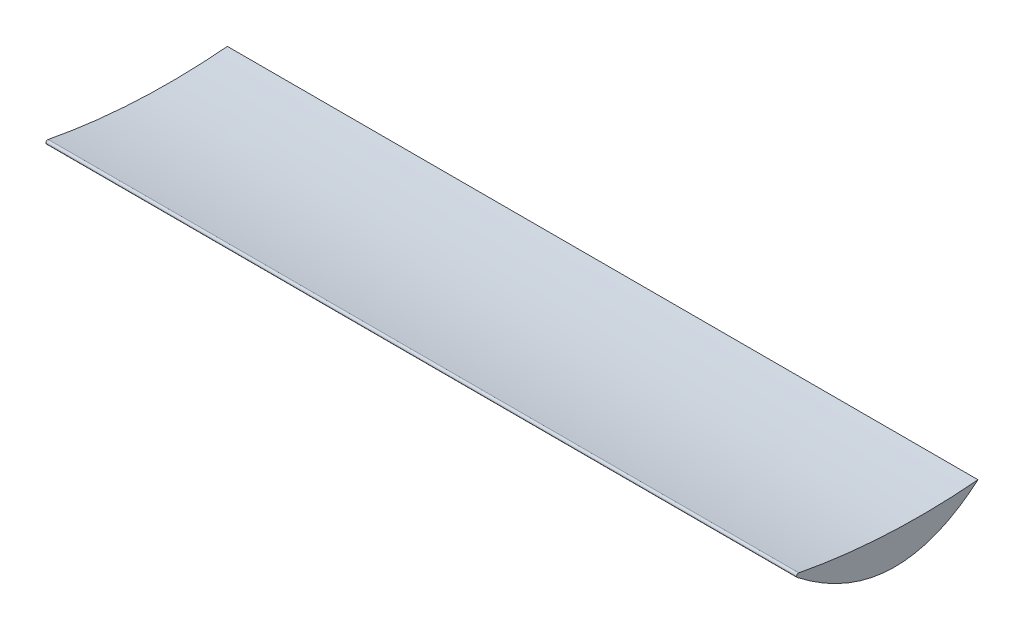
ISO-10303-21;
HEADER;
FILE_DESCRIPTION(('STEP AP214'),'2;1');
FILE_NAME('part.step','',(''),(''),'','','');
FILE_SCHEMA(('AUTOMOTIVE_DESIGN { 1 0 10303 214 1 1 1 1 }'));
ENDSEC;
DATA;
#1=APPLICATION_CONTEXT('core data for automotive mechanical design processes');
#2=APPLICATION_PROTOCOL_DEFINITION('international standard','automotive_design',2000,#1);
#3=PRODUCT_CONTEXT('',#1,'mechanical');
#4=PRODUCT('Part','Part','',(#3));
#5=PRODUCT_RELATED_PRODUCT_CATEGORY('part','',(#4));
#6=PRODUCT_DEFINITION_FORMATION('','',#4);
#7=PRODUCT_DEFINITION_CONTEXT('part definition',#1,'design');
#8=PRODUCT_DEFINITION('design','',#6,#7);
#9=PRODUCT_DEFINITION_SHAPE('','',#8);
#10=(LENGTH_UNIT() NAMED_UNIT(*) SI_UNIT(.MILLI.,.METRE.));
#11=(NAMED_UNIT(*) PLANE_ANGLE_UNIT() SI_UNIT($,.RADIAN.));
#12=(NAMED_UNIT(*) SI_UNIT($,.STERADIAN.) SOLID_ANGLE_UNIT());
#13=UNCERTAINTY_MEASURE_WITH_UNIT(LENGTH_MEASURE(1.E-05),#10,'distance_accuracy_value','');
#14=(GEOMETRIC_REPRESENTATION_CONTEXT(3) GLOBAL_UNCERTAINTY_ASSIGNED_CONTEXT((#13)) GLOBAL_UNIT_ASSIGNED_CONTEXT((#10,
#11,#12)) REPRESENTATION_CONTEXT('',''));
#15=CARTESIAN_POINT('',(0.,0.,0.));
#16=DIRECTION('',(0.,0.,1.));
#17=DIRECTION('',(1.,0.,0.));
#18=AXIS2_PLACEMENT_3D('',#15,#16,#17);
#19=CARTESIAN_POINT('',(1016.,22.7743219498021,120.53122990669));
#20=CARTESIAN_POINT('',(1016.,-89.807220091666,-17.0987614086831));
#21=CARTESIAN_POINT('',(1016.,8.62443920292734,-132.182362196049));
#22=B_SPLINE_CURVE_WITH_KNOTS('',2,(#19,#20,#21),.UNSPECIFIED.,.F.,.F.,(3,3),(0.,1.),.UNSPECIFIED.);
#23=DIRECTION('',(-1.,0.,0.));
#24=VECTOR('',#23,1.);
#25=SURFACE_OF_LINEAR_EXTRUSION('',#22,#24);
#26=CARTESIAN_POINT('',(1016.,16.2568867868757,112.35499397232));
#27=VERTEX_POINT('',#26);
#28=CARTESIAN_POINT('',(1016.,8.62443920292734,-132.182362196049));
#29=VERTEX_POINT('',#28);
#30=EDGE_CURVE('E67',#27,#29,#22,.T.);
#31=ORIENTED_EDGE('',*,*,#30,.F.);
#32=DIRECTION('',(-1.,0.,0.));
#33=VECTOR('',#32,1.);
#34=CARTESIAN_POINT('',(1016.,16.2568867868757,112.35499397232));
#35=LINE('',#34,#33);
#36=CARTESIAN_POINT('',(0.,16.2568867868757,112.35499397232));
#37=VERTEX_POINT('',#36);
#38=EDGE_CURVE('E82',#27,#37,#35,.T.);
#39=ORIENTED_EDGE('',*,*,#38,.T.);
#40=CARTESIAN_POINT('',(0.,22.7743219498021,120.53122990669));
#41=CARTESIAN_POINT('',(0.,-89.807220091666,-17.0987614086831));
#42=CARTESIAN_POINT('',(0.,8.62443920292734,-132.182362196049));
#43=B_SPLINE_CURVE_WITH_KNOTS('',2,(#40,#41,#42),.UNSPECIFIED.,.F.,.F.,(3,3),(0.,1.),.UNSPECIFIED.);
#44=CARTESIAN_POINT('',(0.,8.62443920292734,-132.182362196049));
#45=VERTEX_POINT('',#44);
#46=EDGE_CURVE('E81',#37,#45,#43,.T.);
#47=ORIENTED_EDGE('',*,*,#46,.T.);
#48=DIRECTION('',(-1.,0.,0.));
#49=VECTOR('',#48,1.);
#50=CARTESIAN_POINT('',(1016.,8.62443920292734,-132.182362196049));
#51=LINE('',#50,#49);
#52=EDGE_CURVE('E79',#29,#45,#51,.T.);
#53=ORIENTED_EDGE('',*,*,#52,.F.);
#54=EDGE_LOOP('',(#31,#39,#47,#53));
#55=FACE_BOUND('',#54,.T.);
#56=ADVANCED_FACE('F33',(#55),#25,.F.);
#57=CARTESIAN_POINT('',(1016.,8.62443920292734,-132.182362196049));
#58=CARTESIAN_POINT('',(1016.,-2.67182257546493,-4.49078396432558));
#59=CARTESIAN_POINT('',(1016.,22.7743219498021,120.53122990669));
#60=B_SPLINE_CURVE_WITH_KNOTS('',2,(#57,#58,#59),.UNSPECIFIED.,.F.,.F.,(3,3),(0.,1.),.UNSPECIFIED.);
#61=DIRECTION('',(-1.,0.,0.));
#62=VECTOR('',#61,1.);
#63=SURFACE_OF_LINEAR_EXTRUSION('',#60,#62);
#64=CARTESIAN_POINT('',(0.,8.62443920292734,-132.182362196049));
#65=CARTESIAN_POINT('',(0.,-2.67182257546493,-4.49078396432558));
#66=CARTESIAN_POINT('',(0.,22.7743219498021,120.53122990669));
#67=B_SPLINE_CURVE_WITH_KNOTS('',2,(#64,#65,#66),.UNSPECIFIED.,.F.,.F.,(3,3),(0.,1.),.UNSPECIFIED.);
#68=CARTESIAN_POINT('',(0.,20.7581671917447,110.320222877052));
#69=VERTEX_POINT('',#68);
#70=EDGE_CURVE('E75',#45,#69,#67,.T.);
#71=ORIENTED_EDGE('',*,*,#70,.T.);
#72=DIRECTION('',(-1.,0.,0.));
#73=VECTOR('',#72,1.);
#74=CARTESIAN_POINT('',(0.,20.7581671917447,110.320222877052));
#75=LINE('',#74,#73);
#76=CARTESIAN_POINT('',(1016.,20.7581671917447,110.320222877052));
#77=VERTEX_POINT('',#76);
#78=EDGE_CURVE('E41',#69,#77,#75,.F.);
#79=ORIENTED_EDGE('',*,*,#78,.T.);
#80=EDGE_CURVE('E69',#29,#77,#60,.T.);
#81=ORIENTED_EDGE('',*,*,#80,.F.);
#82=ORIENTED_EDGE('',*,*,#52,.T.);
#83=EDGE_LOOP('',(#71,#79,#81,#82));
#84=FACE_BOUND('',#83,.T.);
#85=ADVANCED_FACE('F78',(#84),#63,.F.);
#86=CARTESIAN_POINT('',(1016.,-37.0539197576507,-11.4621637766814));
#87=DIRECTION('',(1.,0.,0.));
#88=DIRECTION('',(0.,0.,-1.));
#89=AXIS2_PLACEMENT_3D('',#86,#87,#88);
#90=PLANE('',#89);
#91=ORIENTED_EDGE('',*,*,#80,.T.);
#92=CARTESIAN_POINT('',(1016.,18.2634381579469,110.79763993574));
#93=DIRECTION('',(1.,0.,0.));
#94=DIRECTION('',(0.,0.,-1.));
#95=AXIS2_PLACEMENT_3D('',#92,#93,#94);
#96=CIRCLE('',#95,2.54);
#97=EDGE_CURVE('E11',#77,#27,#96,.T.);
#98=ORIENTED_EDGE('',*,*,#97,.T.);
#99=ORIENTED_EDGE('',*,*,#30,.T.);
#100=EDGE_LOOP('',(#91,#98,#99));
#101=FACE_BOUND('',#100,.T.);
#102=ADVANCED_FACE('F68',(#101),#90,.T.);
#103=CARTESIAN_POINT('',(0.,-37.0539197576507,-11.4621637766814));
#104=DIRECTION('',(1.,0.,0.));
#105=DIRECTION('',(0.,0.,-1.));
#106=AXIS2_PLACEMENT_3D('',#103,#104,#105);
#107=PLANE('',#106);
#108=ORIENTED_EDGE('',*,*,#46,.F.);
#109=CARTESIAN_POINT('',(0.,18.2634381579469,110.79763993574));
#110=DIRECTION('',(1.,0.,0.));
#111=DIRECTION('',(0.,0.,-1.));
#112=AXIS2_PLACEMENT_3D('',#109,#110,#111);
#113=CIRCLE('',#112,2.54);
#114=EDGE_CURVE('E55',#37,#69,#113,.F.);
#115=ORIENTED_EDGE('',*,*,#114,.T.);
#116=ORIENTED_EDGE('',*,*,#70,.F.);
#117=EDGE_LOOP('',(#108,#115,#116));
#118=FACE_BOUND('',#117,.T.);
#119=ADVANCED_FACE('F110',(#118),#107,.F.);
#120=CARTESIAN_POINT('',(508.,18.2634381579469,110.79763993574));
#121=DIRECTION('',(-1.,0.,0.));
#122=DIRECTION('',(0.,0.,1.));
#123=AXIS2_PLACEMENT_3D('',#120,#121,#122);
#124=CYLINDRICAL_SURFACE('',#123,2.54);
#125=ORIENTED_EDGE('',*,*,#97,.F.);
#126=ORIENTED_EDGE('',*,*,#78,.F.);
#127=ORIENTED_EDGE('',*,*,#114,.F.);
#128=ORIENTED_EDGE('',*,*,#38,.F.);
#129=EDGE_LOOP('',(#125,#126,#127,#128));
#130=FACE_BOUND('',#129,.T.);
#131=ADVANCED_FACE('F35',(#130),#124,.T.);
#132=CLOSED_SHELL('',(#56,#85,#102,#119,#131));
#133=MANIFOLD_SOLID_BREP('B2',#132);
#134=ADVANCED_BREP_SHAPE_REPRESENTATION('',(#18,#133),#14);
#135=SHAPE_DEFINITION_REPRESENTATION(#9,#134);
ENDSEC;
END-ISO-10303-21;
